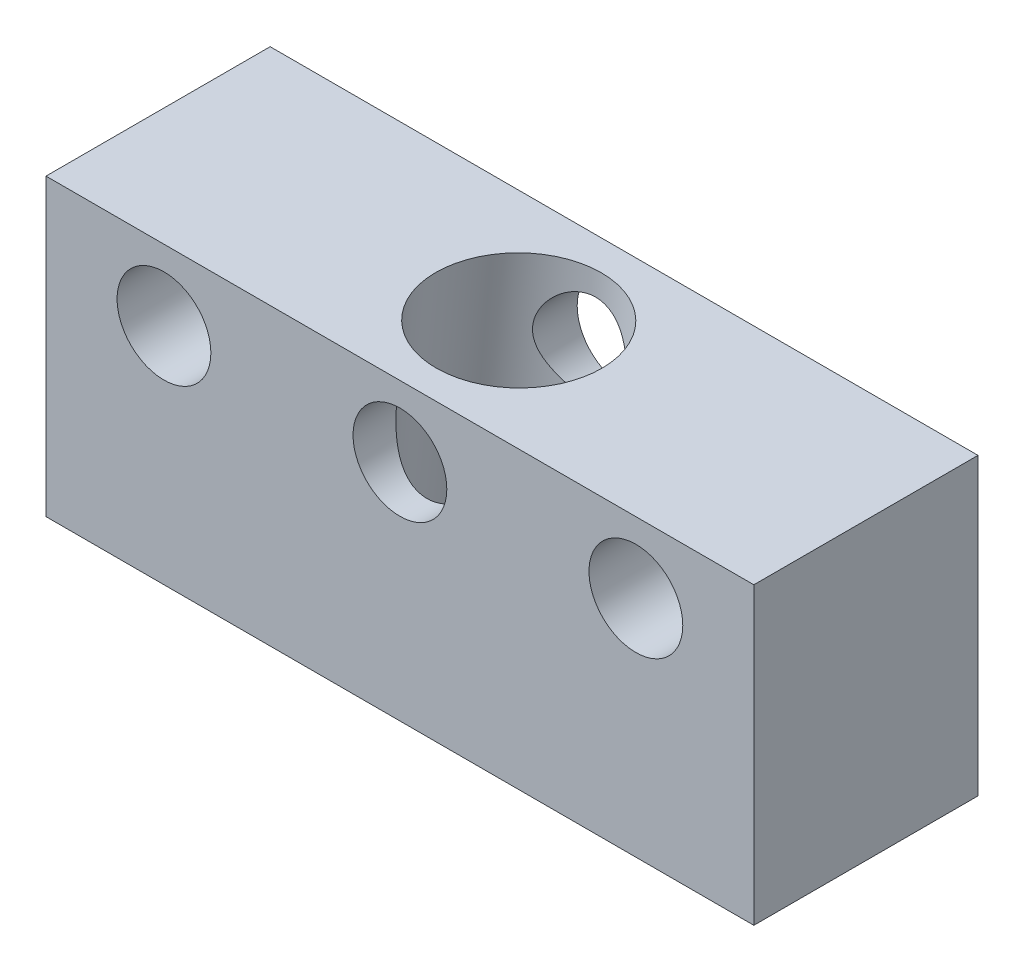
ISO-10303-21;
HEADER;
FILE_DESCRIPTION(('STEP AP214'),'2;1');
FILE_NAME('part.step','',(''),(''),'','','');
FILE_SCHEMA(('AUTOMOTIVE_DESIGN { 1 0 10303 214 1 1 1 1 }'));
ENDSEC;
DATA;
#1=APPLICATION_CONTEXT('core data for automotive mechanical design processes');
#2=APPLICATION_PROTOCOL_DEFINITION('international standard','automotive_design',2000,#1);
#3=PRODUCT_CONTEXT('',#1,'mechanical');
#4=PRODUCT('Part','Part','',(#3));
#5=PRODUCT_RELATED_PRODUCT_CATEGORY('part','',(#4));
#6=PRODUCT_DEFINITION_FORMATION('','',#4);
#7=PRODUCT_DEFINITION_CONTEXT('part definition',#1,'design');
#8=PRODUCT_DEFINITION('design','',#6,#7);
#9=PRODUCT_DEFINITION_SHAPE('','',#8);
#10=(LENGTH_UNIT() NAMED_UNIT(*) SI_UNIT(.MILLI.,.METRE.));
#11=(NAMED_UNIT(*) PLANE_ANGLE_UNIT() SI_UNIT($,.RADIAN.));
#12=(NAMED_UNIT(*) SI_UNIT($,.STERADIAN.) SOLID_ANGLE_UNIT());
#13=UNCERTAINTY_MEASURE_WITH_UNIT(LENGTH_MEASURE(1.E-05),#10,'distance_accuracy_value','');
#14=(GEOMETRIC_REPRESENTATION_CONTEXT(3) GLOBAL_UNCERTAINTY_ASSIGNED_CONTEXT((#13)) GLOBAL_UNIT_ASSIGNED_CONTEXT((#10,
#11,#12)) REPRESENTATION_CONTEXT('',''));
#15=CARTESIAN_POINT('',(0.,0.,0.));
#16=DIRECTION('',(0.,0.,1.));
#17=DIRECTION('',(1.,0.,0.));
#18=AXIS2_PLACEMENT_3D('',#15,#16,#17);
#19=CARTESIAN_POINT('',(30.,-19.,19.));
#20=DIRECTION('',(0.,-1.,0.));
#21=DIRECTION('',(0.,0.,-1.));
#22=AXIS2_PLACEMENT_3D('',#19,#20,#21);
#23=PLANE('',#22);
#24=DIRECTION('',(0.,0.,-1.));
#25=VECTOR('',#24,1.);
#26=CARTESIAN_POINT('',(30.,-19.,19.));
#27=LINE('',#26,#25);
#28=CARTESIAN_POINT('',(30.,-19.,19.));
#29=VERTEX_POINT('',#28);
#30=CARTESIAN_POINT('',(30.,-19.,0.));
#31=VERTEX_POINT('',#30);
#32=EDGE_CURVE('E44',#29,#31,#27,.T.);
#33=ORIENTED_EDGE('',*,*,#32,.F.);
#34=DIRECTION('',(-1.,0.,0.));
#35=VECTOR('',#34,1.);
#36=CARTESIAN_POINT('',(30.,-19.,19.));
#37=LINE('',#36,#35);
#38=CARTESIAN_POINT('',(-30.,-19.,19.));
#39=VERTEX_POINT('',#38);
#40=EDGE_CURVE('E85',#29,#39,#37,.T.);
#41=ORIENTED_EDGE('',*,*,#40,.T.);
#42=DIRECTION('',(0.,0.,-1.));
#43=VECTOR('',#42,1.);
#44=CARTESIAN_POINT('',(-30.,-19.,19.));
#45=LINE('',#44,#43);
#46=CARTESIAN_POINT('',(-30.,-19.,0.));
#47=VERTEX_POINT('',#46);
#48=EDGE_CURVE('E11',#39,#47,#45,.T.);
#49=ORIENTED_EDGE('',*,*,#48,.T.);
#50=DIRECTION('',(-1.,0.,0.));
#51=VECTOR('',#50,1.);
#52=CARTESIAN_POINT('',(30.,-19.,0.));
#53=LINE('',#52,#51);
#54=EDGE_CURVE('E82',#31,#47,#53,.T.);
#55=ORIENTED_EDGE('',*,*,#54,.F.);
#56=EDGE_LOOP('',(#33,#41,#49,#55));
#57=FACE_BOUND('',#56,.T.);
#58=CARTESIAN_POINT('',(-1.99698047004793,-19.,9.5593296149508));
#59=DIRECTION('',(0.,-1.,0.));
#60=DIRECTION('',(1.,0.,0.));
#61=AXIS2_PLACEMENT_3D('',#58,#59,#60);
#62=ELLIPSE('',#61,7.03855795694462,7.);
#63=CARTESIAN_POINT('',(5.04157748689668,-19.,9.5593296149508));
#64=VERTEX_POINT('',#63);
#65=EDGE_CURVE('E190',#64,#64,#62,.F.);
#66=ORIENTED_EDGE('',*,*,#65,.T.);
#67=EDGE_LOOP('',(#66));
#68=FACE_BOUND('',#67,.T.);
#69=ADVANCED_FACE('F32',(#57,#68),#23,.T.);
#70=CARTESIAN_POINT('',(-30.,6.,19.));
#71=DIRECTION('',(0.,1.,0.));
#72=DIRECTION('',(0.,0.,1.));
#73=AXIS2_PLACEMENT_3D('',#70,#71,#72);
#74=PLANE('',#73);
#75=DIRECTION('',(1.,0.,0.));
#76=VECTOR('',#75,1.);
#77=CARTESIAN_POINT('',(-30.,6.,19.));
#78=LINE('',#77,#76);
#79=CARTESIAN_POINT('',(-30.,6.,19.));
#80=VERTEX_POINT('',#79);
#81=CARTESIAN_POINT('',(30.,6.00000000000001,19.));
#82=VERTEX_POINT('',#81);
#83=EDGE_CURVE('E109',#80,#82,#78,.T.);
#84=ORIENTED_EDGE('',*,*,#83,.T.);
#85=DIRECTION('',(0.,0.,-1.));
#86=VECTOR('',#85,1.);
#87=CARTESIAN_POINT('',(30.,6.00000000000001,19.));
#88=LINE('',#87,#86);
#89=CARTESIAN_POINT('',(30.,6.00000000000001,0.));
#90=VERTEX_POINT('',#89);
#91=EDGE_CURVE('E60',#82,#90,#88,.T.);
#92=ORIENTED_EDGE('',*,*,#91,.T.);
#93=DIRECTION('',(1.,0.,0.));
#94=VECTOR('',#93,1.);
#95=CARTESIAN_POINT('',(-30.,6.,0.));
#96=LINE('',#95,#94);
#97=CARTESIAN_POINT('',(-30.,6.,0.));
#98=VERTEX_POINT('',#97);
#99=EDGE_CURVE('E99',#98,#90,#96,.T.);
#100=ORIENTED_EDGE('',*,*,#99,.F.);
#101=DIRECTION('',(0.,0.,-1.));
#102=VECTOR('',#101,1.);
#103=CARTESIAN_POINT('',(-30.,6.,19.));
#104=LINE('',#103,#102);
#105=EDGE_CURVE('E52',#80,#98,#104,.T.);
#106=ORIENTED_EDGE('',*,*,#105,.F.);
#107=EDGE_LOOP('',(#84,#92,#100,#106));
#108=FACE_BOUND('',#107,.T.);
#109=CARTESIAN_POINT('',(0.630625411594081,6.00000000000001,9.5593296149508));
#110=DIRECTION('',(0.,1.,0.));
#111=DIRECTION('',(1.,0.,0.));
#112=AXIS2_PLACEMENT_3D('',#109,#110,#111);
#113=ELLIPSE('',#112,7.03855795694462,7.);
#114=CARTESIAN_POINT('',(7.6691833685387,6.00000000000001,9.5593296149508));
#115=VERTEX_POINT('',#114);
#116=EDGE_CURVE('E192',#115,#115,#113,.F.);
#117=ORIENTED_EDGE('',*,*,#116,.T.);
#118=EDGE_LOOP('',(#117));
#119=FACE_BOUND('',#118,.T.);
#120=ADVANCED_FACE('F138',(#108,#119),#74,.T.);
#121=CARTESIAN_POINT('',(0.,0.,19.));
#122=DIRECTION('',(0.,0.,-1.));
#123=DIRECTION('',(-1.,0.,0.));
#124=AXIS2_PLACEMENT_3D('',#121,#122,#123);
#125=CYLINDRICAL_SURFACE('',#124,3.975);
#126=CARTESIAN_POINT('',(0.,0.,19.));
#127=DIRECTION('',(0.,0.,1.));
#128=DIRECTION('',(1.,0.,0.));
#129=AXIS2_PLACEMENT_3D('',#126,#127,#128);
#130=CIRCLE('',#129,3.975);
#131=CARTESIAN_POINT('',(3.975,0.,19.));
#132=VERTEX_POINT('',#131);
#133=EDGE_CURVE('E169',#132,#132,#130,.T.);
#134=ORIENTED_EDGE('',*,*,#133,.T.);
#135=EDGE_LOOP('',(#134));
#136=FACE_BOUND('',#135,.T.);
#137=CARTESIAN_POINT('',(-3.975,0.,15.3361813339304));
#138=CARTESIAN_POINT('',(-3.97500047989139,0.0970481806565594,15.3292387681374));
#139=CARTESIAN_POINT('',(-3.97144172963903,0.194261433823393,15.324672572208));
#140=CARTESIAN_POINT('',(-3.9571848589753,0.388302226743248,15.3204647751421));
#141=CARTESIAN_POINT('',(-3.9464847183895,0.485129649552569,15.3208245680439));
#142=CARTESIAN_POINT('',(-3.91803147227486,0.677576284530522,15.3264615059162));
#143=CARTESIAN_POINT('',(-3.9002800578635,0.773195780728611,15.3317374722416));
#144=CARTESIAN_POINT('',(-3.85792428021224,0.962536186865656,15.346991811512));
#145=CARTESIAN_POINT('',(-3.83331709859988,1.05625629894301,15.3569721195588));
#146=CARTESIAN_POINT('',(-3.74985033838344,1.3327026619701,15.3933485444413));
#147=CARTESIAN_POINT('',(-3.68119154443769,1.51173557566023,15.4262161926391));
#148=CARTESIAN_POINT('',(-3.52041410030185,1.85566346503102,15.5050484543552));
#149=CARTESIAN_POINT('',(-3.4282811531557,2.02054974258662,15.5510210514902));
#150=CARTESIAN_POINT('',(-3.21549166182137,2.34556654501397,15.6549592643698));
#151=CARTESIAN_POINT('',(-3.09322683441232,2.50443819145012,15.7135613342569));
#152=CARTESIAN_POINT('',(-2.82719328892413,2.80132524659484,15.8346201968408));
#153=CARTESIAN_POINT('',(-2.68341173863801,2.93932811009929,15.8970792766477));
#154=CARTESIAN_POINT('',(-2.35274556331786,3.21213701744919,16.0301805711302));
#155=CARTESIAN_POINT('',(-2.162632391214,3.3432025424566,16.1006076670309));
#156=CARTESIAN_POINT('',(-1.86100008993798,3.51435873627057,16.1993437002622));
#157=CARTESIAN_POINT('',(-1.75764089845717,3.56719607043961,16.2311230417916));
#158=CARTESIAN_POINT('',(-1.54595086662869,3.66390214978027,16.2915464381944));
#159=CARTESIAN_POINT('',(-1.43762268952383,3.70777563212076,16.320192145376));
#160=CARTESIAN_POINT('',(-1.21875464164272,3.78529878931792,16.3730364707627));
#161=CARTESIAN_POINT('',(-1.10829588769283,3.81912686219938,16.3973092362815));
#162=CARTESIAN_POINT('',(-0.884056134722961,3.87717312073469,16.4413590714849));
#163=CARTESIAN_POINT('',(-0.7702769084434,3.90139633701058,16.4611384922707));
#164=CARTESIAN_POINT('',(-0.540361384037402,3.93982342075574,16.4956019850159));
#165=CARTESIAN_POINT('',(-0.424226916948322,3.95403478608047,16.5102898658232));
#166=CARTESIAN_POINT('',(-0.190596121717757,3.97215551146153,16.5341186689357));
#167=CARTESIAN_POINT('',(-0.0731000009435989,3.97606642000198,16.5432604248396));
#168=CARTESIAN_POINT('',(0.147196790159572,3.97360210117976,16.554910645386));
#169=CARTESIAN_POINT('',(0.249976726434201,3.96846518119887,16.5581117907395));
#170=CARTESIAN_POINT('',(0.454904716184942,3.95022424019913,16.5599740338421));
#171=CARTESIAN_POINT('',(0.557052559338502,3.93711769769661,16.5586336941112));
#172=CARTESIAN_POINT('',(0.759817000292978,3.90305797450206,16.5514432115892));
#173=CARTESIAN_POINT('',(0.860434393214299,3.88210902394265,16.5455954982423));
#174=CARTESIAN_POINT('',(1.05943473761621,3.83259139373533,16.5295500338435));
#175=CARTESIAN_POINT('',(1.15781682646044,3.80401982484184,16.5193506324657));
#176=CARTESIAN_POINT('',(1.43884001715543,3.71051469123413,16.4837968871674));
#177=CARTESIAN_POINT('',(1.61772233546716,3.63598247434028,16.4530612490658));
#178=CARTESIAN_POINT('',(1.96066934351659,3.46314514996669,16.3793153312044));
#179=CARTESIAN_POINT('',(2.12473153498226,3.36483604458099,16.336302986989));
#180=CARTESIAN_POINT('',(2.44760953246936,3.13873345577233,16.2375685147596));
#181=CARTESIAN_POINT('',(2.60500307024681,3.0092315101656,16.1811138301627));
#182=CARTESIAN_POINT('',(2.89722748292432,2.72905735119331,16.0623670684478));
#183=CARTESIAN_POINT('',(3.03203790077638,2.57836616825624,16.0000697775897));
#184=CARTESIAN_POINT('',(3.29239197593045,2.23876037289265,15.8669059790873));
#185=CARTESIAN_POINT('',(3.41473502043821,2.04742354638554,15.7959313479327));
#186=CARTESIAN_POINT('',(3.62585452874189,1.64481139323074,15.6607798958892));
#187=CARTESIAN_POINT('',(3.71464607898608,1.43354508141757,15.5966000290979));
#188=CARTESIAN_POINT('',(3.84407946463114,1.03009538445742,15.4926743054462));
#189=CARTESIAN_POINT('',(3.89014295881731,0.840244545442196,15.4506638443549));
#190=CARTESIAN_POINT('',(3.95394493483897,0.453117484262327,15.3826703221956));
#191=CARTESIAN_POINT('',(3.97171862168645,0.255850804268888,15.3566673654876));
#192=CARTESIAN_POINT('',(3.97746278856775,-0.1417655795585,15.3244027714126));
#193=CARTESIAN_POINT('',(3.96529178714064,-0.342125457319322,15.3182351687014));
#194=CARTESIAN_POINT('',(3.91095152708851,-0.738287083145168,15.326941427564));
#195=CARTESIAN_POINT('',(3.86877652377045,-0.934087950907597,15.3418193191362));
#196=CARTESIAN_POINT('',(3.76054059711496,-1.30113345327077,15.3884447107241));
#197=CARTESIAN_POINT('',(3.69642378231771,-1.4731304072916,15.4188968633542));
#198=CARTESIAN_POINT('',(3.54647456987184,-1.80450951855222,15.4921533409526));
#199=CARTESIAN_POINT('',(3.46063401021547,-1.96388690477538,15.5349623094542));
#200=CARTESIAN_POINT('',(3.25860174534778,-2.2852064978301,15.6340905182284));
#201=CARTESIAN_POINT('',(3.14006358578478,-2.44536352056526,15.6913942820798));
#202=CARTESIAN_POINT('',(2.88144349439619,-2.74539293059856,15.8105077006965));
#203=CARTESIAN_POINT('',(2.74134534001411,-2.88524988808934,15.872320729829));
#204=CARTESIAN_POINT('',(2.41846905925894,-3.16287065577758,16.0048544629194));
#205=CARTESIAN_POINT('',(2.23244175854988,-3.29692963591093,16.0754662057311));
#206=CARTESIAN_POINT('',(1.83769503652623,-3.53216155138661,16.2085435829887));
#207=CARTESIAN_POINT('',(1.62897337846517,-3.63333124124625,16.2710084131414));
#208=CARTESIAN_POINT('',(1.30351741235528,-3.75697457802923,16.353330076041));
#209=CARTESIAN_POINT('',(1.19334542523035,-3.79343089300296,16.378810536579));
#210=CARTESIAN_POINT('',(0.969394795855827,-3.85673608291206,16.4253972314057));
#211=CARTESIAN_POINT('',(0.855618050504109,-3.88358992237552,16.4465057236417));
#212=CARTESIAN_POINT('',(0.625434220461438,-3.92723488498121,16.4836951406692));
#213=CARTESIAN_POINT('',(0.509029193821476,-3.9440336162346,16.4997798622354));
#214=CARTESIAN_POINT('',(0.274564851447874,-3.96725454528771,16.5264291493386));
#215=CARTESIAN_POINT('',(0.156505796930239,-3.97367836334455,16.5369945766531));
#216=CARTESIAN_POINT('',(-0.0652180947269524,-3.97581130700223,16.551296727901));
#217=CARTESIAN_POINT('',(-0.16882837403704,-3.97276488822489,16.5557244765372));
#218=CARTESIAN_POINT('',(-0.375624577137486,-3.9585698660625,16.5599807927521));
#219=CARTESIAN_POINT('',(-0.478810355442289,-3.9474186854497,16.5598078967521));
#220=CARTESIAN_POINT('',(-0.683829198945103,-3.91710731906426,16.5548617616438));
#221=CARTESIAN_POINT('',(-0.785663018904066,-3.89795181414958,16.5500912090779));
#222=CARTESIAN_POINT('',(-0.987248530747688,-3.85184074123216,16.5360857637788));
#223=CARTESIAN_POINT('',(-1.08699942310647,-3.82488223500344,16.5268491884814));
#224=CARTESIAN_POINT('',(-1.37054842773146,-3.73627840298137,16.49407987298));
#225=CARTESIAN_POINT('',(-1.5508301261312,-3.66501761765931,16.4651243018071));
#226=CARTESIAN_POINT('',(-1.89703898120041,-3.49841023870251,16.3945877340865));
#227=CARTESIAN_POINT('',(-2.06296369161336,-3.40305955124745,16.3530045913759));
#228=CARTESIAN_POINT('',(-2.38905080970207,-3.1834609518339,16.2570938874273));
#229=CARTESIAN_POINT('',(-2.54793474534873,-3.05762498458185,16.2020635140906));
#230=CARTESIAN_POINT('',(-2.84367750228388,-2.78472192826014,16.0856633270382));
#231=CARTESIAN_POINT('',(-2.98051984290666,-2.63763910718792,16.0242888255444));
#232=CARTESIAN_POINT('',(-3.24589213232012,-2.30553001944209,15.8923355104513));
#233=CARTESIAN_POINT('',(-3.37127244835039,-2.11805981543187,15.8215611704211));
#234=CARTESIAN_POINT('',(-3.58935965426477,-1.72278653466925,15.6856514695324));
#235=CARTESIAN_POINT('',(-3.68205766314536,-1.51497795078842,15.6205176450344));
#236=CARTESIAN_POINT('',(-3.79222517531888,-1.19645151063084,15.5348424652756));
#237=CARTESIAN_POINT('',(-3.82366829951175,-1.09188136618449,15.5088117843773));
#238=CARTESIAN_POINT('',(-3.87799486591814,-0.879636958296551,15.4608784031631));
#239=CARTESIAN_POINT('',(-3.9008829045948,-0.771964395309941,15.4389734893091));
#240=CARTESIAN_POINT('',(-3.93769819649824,-0.554363746550246,15.4001946098782));
#241=CARTESIAN_POINT('',(-3.95163821077562,-0.4444391046055,15.3833134982281));
#242=CARTESIAN_POINT('',(-3.97028801907828,-0.223082289555008,15.3553009534764));
#243=CARTESIAN_POINT('',(-3.97499944790248,-0.111650386975323,15.3441685022848));
#244=CARTESIAN_POINT('',(-3.975,0.,15.3361813339304));
#245=B_SPLINE_CURVE_WITH_KNOTS('',3,(#137,#138,#139,#140,#141,#142,#143,#144,#145,#146,#147,
#148,#149,#150,#151,#152,#153,#154,#155,#156,#157,#158,#159,#160,#161,#162,#163,#164,#165,#166,
#167,#168,#169,#170,#171,#172,#173,#174,#175,#176,#177,#178,#179,#180,#181,#182,#183,#184,#185,
#186,#187,#188,#189,#190,#191,#192,#193,#194,#195,#196,#197,#198,#199,#200,#201,#202,#203,#204,
#205,#206,#207,#208,#209,#210,#211,#212,#213,#214,#215,#216,#217,#218,#219,#220,#221,#222,#223,
#224,#225,#226,#227,#228,#229,#230,#231,#232,#233,#234,#235,#236,#237,#238,#239,#240,#241,#242,
#243,#244),.UNSPECIFIED.,.T.,.F.,(4,2,2,2,2,2,2,2,2,2,2,2,2,2,2,2,2,2,2,2,2,2,2,2,2,2,2,2,2,2,2,
2,2,2,2,2,2,2,2,2,2,2,2,2,2,2,2,2,2,2,2,2,2,4),(0.,0.291781748543732,0.583646072045574,
0.875440439514902,1.16735493967432,1.74812667301042,2.32925297503411,2.95346298618016,
3.57804676015571,4.29847876762665,4.65915610355868,5.01964233478198,5.37328000126816,
5.72673220170369,6.07991942028743,6.4330535406409,6.74152779802668,7.0500997034254,
7.35850540684544,7.66702817357074,8.25289669865757,8.83886380172357,9.47081863827842,
10.103342874896,10.8139839390026,11.524305081633,12.1213064048448,12.7175642123013,
13.3166445999354,13.9158397209139,14.471779079517,15.0279276256045,15.6475808421931,
16.2677026098167,16.9842202454188,17.7008085648262,18.056810283304,18.4126276800814,
18.7681755092355,19.1236678068769,19.434509166837,19.7454494143019,20.056208080579,
20.3670839158356,20.952312632109,21.5376408686968,22.1651804445379,22.7931870798802,
23.4992864045192,24.2055774551005,24.5419827550295,24.8782070509437,25.2139507755032,
25.5496350193176),.UNSPECIFIED.);
#246=CARTESIAN_POINT('',(-3.975,0.,15.3361813339304));
#247=VERTEX_POINT('',#246);
#248=EDGE_CURVE('E35',#247,#247,#245,.T.);
#249=ORIENTED_EDGE('',*,*,#248,.T.);
#250=EDGE_LOOP('',(#249));
#251=FACE_BOUND('',#250,.T.);
#252=ADVANCED_FACE('F117',(#136,#251),#125,.F.);
#253=CARTESIAN_POINT('',(0.,0.,0.));
#254=DIRECTION('',(0.,0.,1.));
#255=DIRECTION('',(1.,0.,0.));
#256=AXIS2_PLACEMENT_3D('',#253,#254,#255);
#257=CIRCLE('',#256,3.975);
#258=CARTESIAN_POINT('',(3.975,0.,0.));
#259=VERTEX_POINT('',#258);
#260=EDGE_CURVE('E167',#259,#259,#257,.T.);
#261=ORIENTED_EDGE('',*,*,#260,.F.);
#262=EDGE_LOOP('',(#261));
#263=FACE_BOUND('',#262,.T.);
#264=CARTESIAN_POINT('',(-3.975,0.,3.78247789597119));
#265=CARTESIAN_POINT('',(-3.97500215082884,-0.106197785987211,3.77488497736447));
#266=CARTESIAN_POINT('',(-3.97073806823147,-0.212163522724202,3.76444206024709));
#267=CARTESIAN_POINT('',(-3.95386487370301,-0.422791767021502,3.73834076418059));
#268=CARTESIAN_POINT('',(-3.94125310617973,-0.527453849060692,3.72268072633201));
#269=CARTESIAN_POINT('',(-3.89121498659348,-0.838532030447628,3.66874817356559));
#270=CARTESIAN_POINT('',(-3.84158635046614,-1.04190493509323,3.62353416925615));
#271=CARTESIAN_POINT('',(-3.71305739880499,-1.43395008303648,3.52128720873679));
#272=CARTESIAN_POINT('',(-3.63437159844565,-1.62271809362905,3.4643421862587));
#273=CARTESIAN_POINT('',(-3.45011708786312,-1.9845689824803,3.34458208456604));
#274=CARTESIAN_POINT('',(-3.34454626772698,-2.15765062824054,3.28176654488343));
#275=CARTESIAN_POINT('',(-3.09460589799314,-2.50500828898704,3.14849785666132));
#276=CARTESIAN_POINT('',(-2.94714016813872,-2.67704945748486,3.07801193764943));
#277=CARTESIAN_POINT('',(-2.62332198777663,-2.99502699747566,2.94382839855418));
#278=CARTESIAN_POINT('',(-2.44696238591516,-3.1409568875638,2.88013246547928));
#279=CARTESIAN_POINT('',(-2.16245402642796,-3.33735729626342,2.79434862547856));
#280=CARTESIAN_POINT('',(-2.06361560598791,-3.39938711027854,2.76724410247005));
#281=CARTESIAN_POINT('',(-1.86007090727875,-3.51488683329108,2.71722743309729));
#282=CARTESIAN_POINT('',(-1.75536758652153,-3.56836100512899,2.69431319810736));
#283=CARTESIAN_POINT('',(-1.54091192475665,-3.6660734165526,2.65338288133993));
#284=CARTESIAN_POINT('',(-1.43116335126532,-3.71031841552506,2.63536321187058));
#285=CARTESIAN_POINT('',(-1.20747713379455,-3.78901998150538,2.60477565383658));
#286=CARTESIAN_POINT('',(-1.0935401703831,-3.82347813089938,2.59220688377025));
#287=CARTESIAN_POINT('',(-0.876756833964868,-3.8785113803566,2.57412247858769));
#288=CARTESIAN_POINT('',(-0.77426589651499,-3.90027144150094,2.56793043937896));
#289=CARTESIAN_POINT('',(-0.56771855999661,-3.93564444106867,2.56022482139108));
#290=CARTESIAN_POINT('',(-0.463662299051972,-3.94925809405669,2.55871083222685));
#291=CARTESIAN_POINT('',(-0.254859938033021,-3.96820524960591,2.56040455511656));
#292=CARTESIAN_POINT('',(-0.15011402821456,-3.97354094701815,2.56361101513169));
#293=CARTESIAN_POINT('',(0.0591995652565494,-3.97593919697779,2.57464712791937));
#294=CARTESIAN_POINT('',(0.163767252115164,-3.97300189994978,2.58247669662971));
#295=CARTESIAN_POINT('',(0.46161781877587,-3.95286569618295,2.6112407475363));
#296=CARTESIAN_POINT('',(0.653799046370333,-3.9255683286804,2.6376544711195));
#297=CARTESIAN_POINT('',(1.02986775511591,-3.84410129982425,2.70360134854594));
#298=CARTESIAN_POINT('',(1.21375382169214,-3.78992707391343,2.74313673049224));
#299=CARTESIAN_POINT('',(1.58088709509739,-3.65269492444262,2.83499985834329));
#300=CARTESIAN_POINT('',(1.76337407228907,-3.56804152130929,2.8879733544467));
#301=CARTESIAN_POINT('',(2.11196599855031,-3.37344530754583,3.00093124852771));
#302=CARTESIAN_POINT('',(2.27806126030866,-3.26348766878478,3.0609197470771));
#303=CARTESIAN_POINT('',(2.61108323110206,-3.00543445140988,3.19088290280484));
#304=CARTESIAN_POINT('',(2.77553082959706,-2.85429292399801,3.2611700079341));
#305=CARTESIAN_POINT('',(3.07786634340952,-2.52532057991752,3.3975952914302));
#306=CARTESIAN_POINT('',(3.21573128870384,-2.3474669152831,3.46372984861103));
#307=CARTESIAN_POINT('',(3.40192520791376,-2.05944183416576,3.55481734827628));
#308=CARTESIAN_POINT('',(3.46145416302122,-1.95779218566437,3.58429318591723));
#309=CARTESIAN_POINT('',(3.57165378476535,-1.74867413883729,3.63874027290906));
#310=CARTESIAN_POINT('',(3.62232938582887,-1.64120902579661,3.66371403174751));
#311=CARTESIAN_POINT('',(3.71410168735357,-1.42135185418496,3.70798954432106));
#312=CARTESIAN_POINT('',(3.75521455311068,-1.3089684975348,3.72730088469418));
#313=CARTESIAN_POINT('',(3.8273243682093,-1.08009062962181,3.75930806513894));
#314=CARTESIAN_POINT('',(3.85832396757855,-0.963597204220364,3.77200563876873));
#315=CARTESIAN_POINT('',(3.90583866314032,-0.745379722475619,3.78872137164503));
#316=CARTESIAN_POINT('',(3.92382633160194,-0.644051255866384,3.79375329801277));
#317=CARTESIAN_POINT('',(3.95189123223734,-0.440187119757674,3.79830379949404));
#318=CARTESIAN_POINT('',(3.96196932127926,-0.33765158224564,3.79782297190864));
#319=CARTESIAN_POINT('',(3.97412970357033,-0.132276356518839,3.79136597803349));
#320=CARTESIAN_POINT('',(3.97621179115766,-0.0294366605490237,3.78538967040172));
#321=CARTESIAN_POINT('',(3.97244391032278,0.175630159457644,3.76821137939474));
#322=CARTESIAN_POINT('',(3.96659400344456,0.277857288241194,3.75700943656545));
#323=CARTESIAN_POINT('',(3.93926936811504,0.562677750534628,3.71885986950495));
#324=CARTESIAN_POINT('',(3.90901212950584,0.743782265569719,3.68649442659976));
#325=CARTESIAN_POINT('',(3.82479558635516,1.09760804560763,3.60991680239912));
#326=CARTESIAN_POINT('',(3.77082905402861,1.27032673634488,3.56570101012535));
#327=CARTESIAN_POINT('',(3.63287540352126,1.62590408994321,3.46367465322182));
#328=CARTESIAN_POINT('',(3.54598747128161,1.80734850007652,3.40485693489272));
#329=CARTESIAN_POINT('',(3.34665231743626,2.15421897794995,3.28334399775197));
#330=CARTESIAN_POINT('',(3.2341846403691,2.31963207406243,3.22064570511205));
#331=CARTESIAN_POINT('',(2.96667856845512,2.65557207374983,3.08732867640278));
#332=CARTESIAN_POINT('',(2.80779093035968,2.82317338386959,3.01692546852959));
#333=CARTESIAN_POINT('',(2.54808056385051,3.05308482858017,2.91825706840786));
#334=CARTESIAN_POINT('',(2.45788555344999,3.1261783516274,2.88650637243618));
#335=CARTESIAN_POINT('',(2.27077285046862,3.26461891631863,2.82614969607438));
#336=CARTESIAN_POINT('',(2.17385875126343,3.32997004871018,2.79754205561404));
#337=CARTESIAN_POINT('',(1.97578342789782,3.45110470183163,2.74479097803303));
#338=CARTESIAN_POINT('',(1.87474057958669,3.50704880518882,2.72057190890066));
#339=CARTESIAN_POINT('',(1.66741866702647,3.61022650775042,2.67663379678544));
#340=CARTESIAN_POINT('',(1.56114237714292,3.65746466050477,2.65691240005634));
#341=CARTESIAN_POINT('',(1.34421266960113,3.74263074835328,2.62256735785582));
#342=CARTESIAN_POINT('',(1.23356255757782,3.78056556418321,2.60793994149968));
#343=CARTESIAN_POINT('',(1.00880133621557,3.84664258621677,2.58423272956228));
#344=CARTESIAN_POINT('',(0.894690748766151,3.87478626115894,2.57515210176995));
#345=CARTESIAN_POINT('',(0.678718819114792,3.9179733394506,2.5636151347326));
#346=CARTESIAN_POINT('',(0.577133686964589,3.93422346190864,2.56046620807762));
#347=CARTESIAN_POINT('',(0.372934805278336,3.95880319842629,2.55870575783884));
#348=CARTESIAN_POINT('',(0.270320740370647,3.96713030409739,2.56009567061264));
#349=CARTESIAN_POINT('',(0.0649675351725556,3.97579622081874,2.56738135533157));
#350=CARTESIAN_POINT('',(-0.0377715089309403,3.97613929985467,2.57327471814701));
#351=CARTESIAN_POINT('',(-0.242640397864373,3.96891382624567,2.58940656445596));
#352=CARTESIAN_POINT('',(-0.344769996578985,3.96134226961687,2.59964669688062));
#353=CARTESIAN_POINT('',(-0.639031899169754,3.92808083422487,2.63531910335837));
#354=CARTESIAN_POINT('',(-0.829472882240608,3.89221892155294,2.66613087492123));
#355=CARTESIAN_POINT('',(-1.20078053481809,3.79416976859998,2.74001384499966));
#356=CARTESIAN_POINT('',(-1.38164563625113,3.7319782316881,2.78308704403476));
#357=CARTESIAN_POINT('',(-1.74440026196162,3.57764265250103,2.88194178969475));
#358=CARTESIAN_POINT('',(-1.92524877236611,3.48352550508056,2.93845700638851));
#359=CARTESIAN_POINT('',(-2.26925353074868,3.26989218917203,3.05730262878511));
#360=CARTESIAN_POINT('',(-2.43239360253716,3.15035308845168,3.11963825620068));
#361=CARTESIAN_POINT('',(-2.75750910163238,2.87194113632668,3.25284598750094));
#362=CARTESIAN_POINT('',(-2.91685693356249,2.71003487127268,3.32382233042904));
#363=CARTESIAN_POINT('',(-3.20683437433563,2.3597683573609,3.45893441503945));
#364=CARTESIAN_POINT('',(-3.33747478287518,2.17141810055391,3.52307272449032));
#365=CARTESIAN_POINT('',(-3.54766458575676,1.80334575908364,3.62685258149994));
#366=CARTESIAN_POINT('',(-3.63204308406248,1.62705902889686,3.66877121502639));
#367=CARTESIAN_POINT('',(-3.73893518380576,1.35300273780149,3.71961537780274));
#368=CARTESIAN_POINT('',(-3.77127685604122,1.26008859373372,3.73455393261977));
#369=CARTESIAN_POINT('',(-3.82911147140434,1.07156259673868,3.75993392265681));
#370=CARTESIAN_POINT('',(-3.85460584959141,0.975951313728133,3.77037630046504));
#371=CARTESIAN_POINT('',(-3.90912767311364,0.735555029536747,3.79023699857376));
#372=CARTESIAN_POINT('',(-3.9338259384469,0.589505286455159,3.79667825613083));
#373=CARTESIAN_POINT('',(-3.96676182165257,0.295487959784339,3.7980732401829));
#374=CARTESIAN_POINT('',(-3.97499701226842,0.147520096630729,3.79302527298248));
#375=CARTESIAN_POINT('',(-3.975,0.,3.78247789597119));
#376=B_SPLINE_CURVE_WITH_KNOTS('',3,(#264,#265,#266,#267,#268,#269,#270,#271,#272,#273,#274,
#275,#276,#277,#278,#279,#280,#281,#282,#283,#284,#285,#286,#287,#288,#289,#290,#291,#292,#293,
#294,#295,#296,#297,#298,#299,#300,#301,#302,#303,#304,#305,#306,#307,#308,#309,#310,#311,#312,
#313,#314,#315,#316,#317,#318,#319,#320,#321,#322,#323,#324,#325,#326,#327,#328,#329,#330,#331,
#332,#333,#334,#335,#336,#337,#338,#339,#340,#341,#342,#343,#344,#345,#346,#347,#348,#349,#350,
#351,#352,#353,#354,#355,#356,#357,#358,#359,#360,#361,#362,#363,#364,#365,#366,#367,#368,#369,
#370,#371,#372,#373,#374,#375),.UNSPECIFIED.,.T.,.F.,(4,2,2,2,2,2,2,2,2,2,2,2,2,2,2,2,2,2,2,2,2,
2,2,2,2,2,2,2,2,2,2,2,2,2,2,2,2,2,2,2,2,2,2,2,2,2,2,2,2,2,2,2,2,2,2,4),(0.,0.319231693858983,
0.63856499156554,1.27763224541071,1.91207293358551,2.54656342746573,3.25537437646144,
3.96436102488655,4.32331965112495,4.68209886582913,5.04061438311451,5.39907190080013,
5.71352762828976,6.02795576915659,6.34230052700199,6.65663956927731,7.24151165322084,
7.8264831013243,8.44806465452538,9.07001138251338,9.76951480231164,10.4696199792959,
10.8334590100823,11.1970946033163,11.5601109484059,11.9230320940342,12.231697374515,
12.5403292117551,12.8489689871326,13.157606367802,13.7144689790393,14.271501467928,
14.8978759654489,15.5247531306756,16.2452506020213,16.6059409456671,16.9664398579611,
17.3199673015892,17.673309308601,18.0263891908362,18.3794160857979,18.6877911661105,
18.9962638440174,19.3045716192636,19.6129964546017,20.1989009847846,20.7849011633668,
21.4170497296393,22.0497709717464,22.7605647154908,23.4710905999907,24.0680136127627,
24.3662169461504,24.6643577330753,25.107739374107,25.5511863809148),.UNSPECIFIED.);
#377=CARTESIAN_POINT('',(-3.975,0.,3.78247789597119));
#378=VERTEX_POINT('',#377);
#379=EDGE_CURVE('E113',#378,#378,#376,.T.);
#380=ORIENTED_EDGE('',*,*,#379,.T.);
#381=EDGE_LOOP('',(#380));
#382=FACE_BOUND('',#381,.T.);
#383=ADVANCED_FACE('F146',(#263,#382),#125,.F.);
#384=CARTESIAN_POINT('',(-30.,-19.,19.));
#385=DIRECTION('',(0.,0.,-1.));
#386=DIRECTION('',(-1.,0.,0.));
#387=AXIS2_PLACEMENT_3D('',#384,#385,#386);
#388=PLANE('',#387);
#389=ORIENTED_EDGE('',*,*,#133,.F.);
#390=EDGE_LOOP('',(#389));
#391=FACE_BOUND('',#390,.T.);
#392=DIRECTION('',(0.,-1.,0.));
#393=VECTOR('',#392,1.);
#394=CARTESIAN_POINT('',(-30.,6.,19.));
#395=LINE('',#394,#393);
#396=EDGE_CURVE('E104',#80,#39,#395,.T.);
#397=ORIENTED_EDGE('',*,*,#396,.T.);
#398=ORIENTED_EDGE('',*,*,#40,.F.);
#399=DIRECTION('',(0.,1.,0.));
#400=VECTOR('',#399,1.);
#401=CARTESIAN_POINT('',(30.,-19.,19.));
#402=LINE('',#401,#400);
#403=EDGE_CURVE('E107',#29,#82,#402,.T.);
#404=ORIENTED_EDGE('',*,*,#403,.T.);
#405=ORIENTED_EDGE('',*,*,#83,.F.);
#406=EDGE_LOOP('',(#397,#398,#404,#405));
#407=FACE_BOUND('',#406,.T.);
#408=CARTESIAN_POINT('',(-20.,0.,19.));
#409=DIRECTION('',(0.,0.,1.));
#410=DIRECTION('',(1.,0.,0.));
#411=AXIS2_PLACEMENT_3D('',#408,#409,#410);
#412=CIRCLE('',#411,3.975);
#413=CARTESIAN_POINT('',(-16.025,0.,19.));
#414=VERTEX_POINT('',#413);
#415=EDGE_CURVE('E93',#414,#414,#412,.T.);
#416=ORIENTED_EDGE('',*,*,#415,.F.);
#417=EDGE_LOOP('',(#416));
#418=FACE_BOUND('',#417,.T.);
#419=CARTESIAN_POINT('',(20.,0.,19.));
#420=DIRECTION('',(0.,0.,1.));
#421=DIRECTION('',(1.,0.,0.));
#422=AXIS2_PLACEMENT_3D('',#419,#420,#421);
#423=CIRCLE('',#422,3.975);
#424=CARTESIAN_POINT('',(23.975,0.,19.));
#425=VERTEX_POINT('',#424);
#426=EDGE_CURVE('E170',#425,#425,#423,.T.);
#427=ORIENTED_EDGE('',*,*,#426,.F.);
#428=EDGE_LOOP('',(#427));
#429=FACE_BOUND('',#428,.T.);
#430=ADVANCED_FACE('F158',(#391,#407,#418,#429),#388,.F.);
#431=CARTESIAN_POINT('',(-30.,-19.,0.));
#432=DIRECTION('',(0.,0.,-1.));
#433=DIRECTION('',(-1.,0.,0.));
#434=AXIS2_PLACEMENT_3D('',#431,#432,#433);
#435=PLANE('',#434);
#436=ORIENTED_EDGE('',*,*,#260,.T.);
#437=EDGE_LOOP('',(#436));
#438=FACE_BOUND('',#437,.T.);
#439=DIRECTION('',(0.,-1.,0.));
#440=VECTOR('',#439,1.);
#441=CARTESIAN_POINT('',(-30.,6.,0.));
#442=LINE('',#441,#440);
#443=EDGE_CURVE('E89',#98,#47,#442,.T.);
#444=ORIENTED_EDGE('',*,*,#443,.F.);
#445=ORIENTED_EDGE('',*,*,#99,.T.);
#446=DIRECTION('',(0.,1.,0.));
#447=VECTOR('',#446,1.);
#448=CARTESIAN_POINT('',(30.,-19.,0.));
#449=LINE('',#448,#447);
#450=EDGE_CURVE('E97',#31,#90,#449,.T.);
#451=ORIENTED_EDGE('',*,*,#450,.F.);
#452=ORIENTED_EDGE('',*,*,#54,.T.);
#453=EDGE_LOOP('',(#444,#445,#451,#452));
#454=FACE_BOUND('',#453,.T.);
#455=CARTESIAN_POINT('',(-20.,0.,0.));
#456=DIRECTION('',(0.,0.,1.));
#457=DIRECTION('',(1.,0.,0.));
#458=AXIS2_PLACEMENT_3D('',#455,#456,#457);
#459=CIRCLE('',#458,3.975);
#460=CARTESIAN_POINT('',(-16.025,0.,0.));
#461=VERTEX_POINT('',#460);
#462=EDGE_CURVE('E173',#461,#461,#459,.T.);
#463=ORIENTED_EDGE('',*,*,#462,.T.);
#464=EDGE_LOOP('',(#463));
#465=FACE_BOUND('',#464,.T.);
#466=CARTESIAN_POINT('',(20.,0.,0.));
#467=DIRECTION('',(0.,0.,1.));
#468=DIRECTION('',(1.,0.,0.));
#469=AXIS2_PLACEMENT_3D('',#466,#467,#468);
#470=CIRCLE('',#469,3.975);
#471=CARTESIAN_POINT('',(23.975,0.,0.));
#472=VERTEX_POINT('',#471);
#473=EDGE_CURVE('E175',#472,#472,#470,.T.);
#474=ORIENTED_EDGE('',*,*,#473,.T.);
#475=EDGE_LOOP('',(#474));
#476=FACE_BOUND('',#475,.T.);
#477=ADVANCED_FACE('F95',(#438,#454,#465,#476),#435,.T.);
#478=CARTESIAN_POINT('',(-30.,6.,19.));
#479=DIRECTION('',(1.,0.,0.));
#480=DIRECTION('',(0.,0.,-1.));
#481=AXIS2_PLACEMENT_3D('',#478,#479,#480);
#482=PLANE('',#481);
#483=ORIENTED_EDGE('',*,*,#48,.F.);
#484=ORIENTED_EDGE('',*,*,#396,.F.);
#485=ORIENTED_EDGE('',*,*,#105,.T.);
#486=ORIENTED_EDGE('',*,*,#443,.T.);
#487=EDGE_LOOP('',(#483,#484,#485,#486));
#488=FACE_BOUND('',#487,.T.);
#489=ADVANCED_FACE('F90',(#488),#482,.F.);
#490=CARTESIAN_POINT('',(30.,-19.,19.));
#491=DIRECTION('',(-1.,0.,0.));
#492=DIRECTION('',(0.,0.,1.));
#493=AXIS2_PLACEMENT_3D('',#490,#491,#492);
#494=PLANE('',#493);
#495=ORIENTED_EDGE('',*,*,#91,.F.);
#496=ORIENTED_EDGE('',*,*,#403,.F.);
#497=ORIENTED_EDGE('',*,*,#32,.T.);
#498=ORIENTED_EDGE('',*,*,#450,.T.);
#499=EDGE_LOOP('',(#495,#496,#497,#498));
#500=FACE_BOUND('',#499,.T.);
#501=ADVANCED_FACE('F133',(#500),#494,.F.);
#502=CARTESIAN_POINT('',(-20.,0.,19.));
#503=DIRECTION('',(0.,0.,-1.));
#504=DIRECTION('',(-1.,0.,0.));
#505=AXIS2_PLACEMENT_3D('',#502,#503,#504);
#506=CYLINDRICAL_SURFACE('',#505,3.975);
#507=ORIENTED_EDGE('',*,*,#415,.T.);
#508=EDGE_LOOP('',(#507));
#509=FACE_BOUND('',#508,.T.);
#510=ORIENTED_EDGE('',*,*,#462,.F.);
#511=EDGE_LOOP('',(#510));
#512=FACE_BOUND('',#511,.T.);
#513=ADVANCED_FACE('F128',(#509,#512),#506,.F.);
#514=CARTESIAN_POINT('',(20.,0.,19.));
#515=DIRECTION('',(0.,0.,-1.));
#516=DIRECTION('',(-1.,0.,0.));
#517=AXIS2_PLACEMENT_3D('',#514,#515,#516);
#518=CYLINDRICAL_SURFACE('',#517,3.975);
#519=ORIENTED_EDGE('',*,*,#426,.T.);
#520=EDGE_LOOP('',(#519));
#521=FACE_BOUND('',#520,.T.);
#522=ORIENTED_EDGE('',*,*,#473,.F.);
#523=EDGE_LOOP('',(#522));
#524=FACE_BOUND('',#523,.T.);
#525=ADVANCED_FACE('F124',(#521,#524),#518,.F.);
#526=CARTESIAN_POINT('',(0.951521061446227,9.05311816446793,9.5593296149508));
#527=DIRECTION('',(0.104528463267657,0.994521895368274,0.));
#528=DIRECTION('',(-0.994521895368274,0.104528463267657,0.));
#529=AXIS2_PLACEMENT_3D('',#526,#527,#528);
#530=CYLINDRICAL_SURFACE('',#529,7.);
#531=ORIENTED_EDGE('',*,*,#65,.F.);
#532=EDGE_LOOP('',(#531));
#533=FACE_BOUND('',#532,.T.);
#534=ORIENTED_EDGE('',*,*,#116,.F.);
#535=EDGE_LOOP('',(#534));
#536=FACE_BOUND('',#535,.T.);
#537=ORIENTED_EDGE('',*,*,#248,.F.);
#538=EDGE_LOOP('',(#537));
#539=FACE_BOUND('',#538,.T.);
#540=ORIENTED_EDGE('',*,*,#379,.F.);
#541=EDGE_LOOP('',(#540));
#542=FACE_BOUND('',#541,.T.);
#543=ADVANCED_FACE('F121',(#533,#536,#539,#542),#530,.F.);
#544=CLOSED_SHELL('',(#69,#120,#252,#383,#430,#477,#489,#501,#513,#525,#543));
#545=MANIFOLD_SOLID_BREP('B2',#544);
#546=ADVANCED_BREP_SHAPE_REPRESENTATION('',(#18,#545),#14);
#547=SHAPE_DEFINITION_REPRESENTATION(#9,#546);
ENDSEC;
END-ISO-10303-21;
